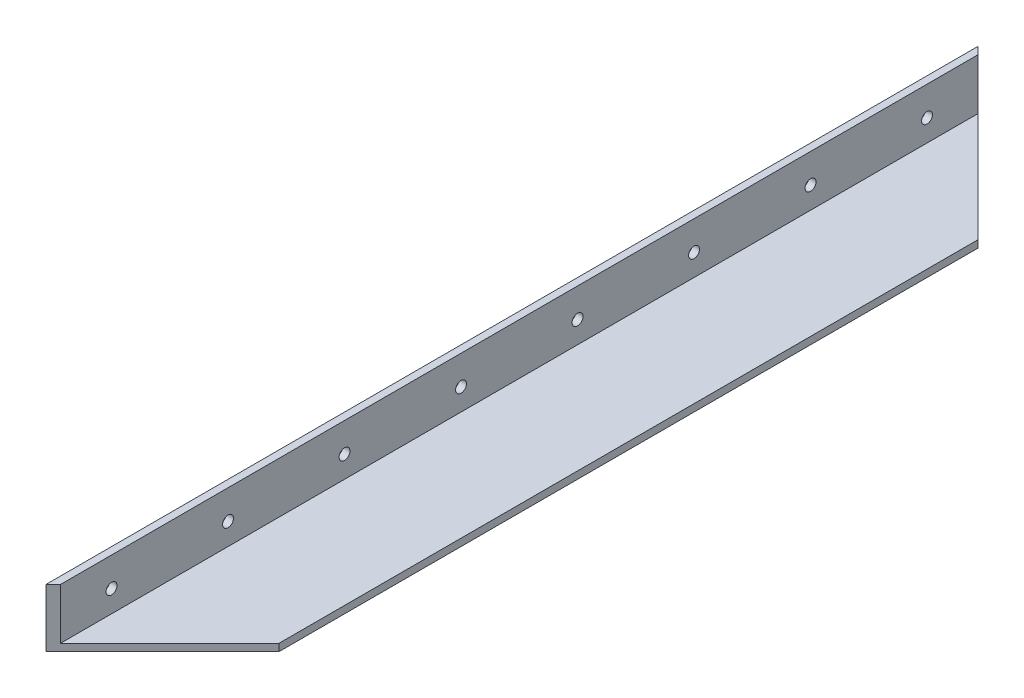
ISO-10303-21;
HEADER;
FILE_DESCRIPTION(('STEP AP214'),'2;1');
FILE_NAME('part.step','',(''),(''),'','','');
FILE_SCHEMA(('AUTOMOTIVE_DESIGN { 1 0 10303 214 1 1 1 1 }'));
ENDSEC;
DATA;
#1=APPLICATION_CONTEXT('core data for automotive mechanical design processes');
#2=APPLICATION_PROTOCOL_DEFINITION('international standard','automotive_design',2000,#1);
#3=PRODUCT_CONTEXT('',#1,'mechanical');
#4=PRODUCT('Part','Part','',(#3));
#5=PRODUCT_RELATED_PRODUCT_CATEGORY('part','',(#4));
#6=PRODUCT_DEFINITION_FORMATION('','',#4);
#7=PRODUCT_DEFINITION_CONTEXT('part definition',#1,'design');
#8=PRODUCT_DEFINITION('design','',#6,#7);
#9=PRODUCT_DEFINITION_SHAPE('','',#8);
#10=(LENGTH_UNIT() NAMED_UNIT(*) SI_UNIT(.MILLI.,.METRE.));
#11=(NAMED_UNIT(*) PLANE_ANGLE_UNIT() SI_UNIT($,.RADIAN.));
#12=(NAMED_UNIT(*) SI_UNIT($,.STERADIAN.) SOLID_ANGLE_UNIT());
#13=UNCERTAINTY_MEASURE_WITH_UNIT(LENGTH_MEASURE(1.E-05),#10,'distance_accuracy_value','');
#14=(GEOMETRIC_REPRESENTATION_CONTEXT(3) GLOBAL_UNCERTAINTY_ASSIGNED_CONTEXT((#13)) GLOBAL_UNIT_ASSIGNED_CONTEXT((#10,
#11,#12)) REPRESENTATION_CONTEXT('',''));
#15=CARTESIAN_POINT('',(0.,0.,0.));
#16=DIRECTION('',(0.,0.,1.));
#17=DIRECTION('',(1.,0.,0.));
#18=AXIS2_PLACEMENT_3D('',#15,#16,#17);
#19=CARTESIAN_POINT('',(3.175,0.,406.4));
#20=DIRECTION('',(1.,0.,0.));
#21=DIRECTION('',(0.,1.,0.));
#22=AXIS2_PLACEMENT_3D('',#19,#20,#21);
#23=PLANE('',#22);
#24=CARTESIAN_POINT('',(3.175,12.7,381.));
#25=DIRECTION('',(1.,0.,0.));
#26=DIRECTION('',(0.,1.,0.));
#27=AXIS2_PLACEMENT_3D('',#24,#25,#26);
#28=CIRCLE('',#27,2.38125000000001);
#29=CARTESIAN_POINT('',(3.175,15.08125,381.));
#30=VERTEX_POINT('',#29);
#31=EDGE_CURVE('E123',#30,#30,#28,.T.);
#32=ORIENTED_EDGE('',*,*,#31,.F.);
#33=EDGE_LOOP('',(#32));
#34=FACE_BOUND('',#33,.T.);
#35=CARTESIAN_POINT('',(3.175,12.7,330.2));
#36=DIRECTION('',(1.,0.,0.));
#37=DIRECTION('',(0.,1.,0.));
#38=AXIS2_PLACEMENT_3D('',#35,#36,#37);
#39=CIRCLE('',#38,2.38125000000001);
#40=CARTESIAN_POINT('',(3.175,15.08125,330.2));
#41=VERTEX_POINT('',#40);
#42=EDGE_CURVE('E262',#41,#41,#39,.T.);
#43=ORIENTED_EDGE('',*,*,#42,.F.);
#44=EDGE_LOOP('',(#43));
#45=FACE_BOUND('',#44,.T.);
#46=CARTESIAN_POINT('',(3.175,12.7,279.4));
#47=DIRECTION('',(1.,0.,0.));
#48=DIRECTION('',(0.,1.,0.));
#49=AXIS2_PLACEMENT_3D('',#46,#47,#48);
#50=CIRCLE('',#49,2.38125000000001);
#51=CARTESIAN_POINT('',(3.175,15.08125,279.4));
#52=VERTEX_POINT('',#51);
#53=EDGE_CURVE('E260',#52,#52,#50,.T.);
#54=ORIENTED_EDGE('',*,*,#53,.F.);
#55=EDGE_LOOP('',(#54));
#56=FACE_BOUND('',#55,.T.);
#57=CARTESIAN_POINT('',(3.175,12.7,228.6));
#58=DIRECTION('',(1.,0.,0.));
#59=DIRECTION('',(0.,1.,0.));
#60=AXIS2_PLACEMENT_3D('',#57,#58,#59);
#61=CIRCLE('',#60,2.38125000000001);
#62=CARTESIAN_POINT('',(3.175,15.08125,228.6));
#63=VERTEX_POINT('',#62);
#64=EDGE_CURVE('E257',#63,#63,#61,.T.);
#65=ORIENTED_EDGE('',*,*,#64,.F.);
#66=EDGE_LOOP('',(#65));
#67=FACE_BOUND('',#66,.T.);
#68=CARTESIAN_POINT('',(3.175,12.7,177.8));
#69=DIRECTION('',(1.,0.,0.));
#70=DIRECTION('',(0.,1.,0.));
#71=AXIS2_PLACEMENT_3D('',#68,#69,#70);
#72=CIRCLE('',#71,2.38125000000006);
#73=CARTESIAN_POINT('',(3.175,15.0812500000001,177.8));
#74=VERTEX_POINT('',#73);
#75=EDGE_CURVE('E254',#74,#74,#72,.T.);
#76=ORIENTED_EDGE('',*,*,#75,.F.);
#77=EDGE_LOOP('',(#76));
#78=FACE_BOUND('',#77,.T.);
#79=CARTESIAN_POINT('',(3.175,12.7,127.));
#80=DIRECTION('',(1.,0.,0.));
#81=DIRECTION('',(0.,1.,0.));
#82=AXIS2_PLACEMENT_3D('',#79,#80,#81);
#83=CIRCLE('',#82,2.38125000000001);
#84=CARTESIAN_POINT('',(3.175,15.08125,127.));
#85=VERTEX_POINT('',#84);
#86=EDGE_CURVE('E251',#85,#85,#83,.T.);
#87=ORIENTED_EDGE('',*,*,#86,.F.);
#88=EDGE_LOOP('',(#87));
#89=FACE_BOUND('',#88,.T.);
#90=CARTESIAN_POINT('',(3.175,12.7,76.2000000000002));
#91=DIRECTION('',(1.,0.,0.));
#92=DIRECTION('',(0.,1.,0.));
#93=AXIS2_PLACEMENT_3D('',#90,#91,#92);
#94=CIRCLE('',#93,2.38125000000001);
#95=CARTESIAN_POINT('',(3.175,15.08125,76.2000000000002));
#96=VERTEX_POINT('',#95);
#97=EDGE_CURVE('E226',#96,#96,#94,.T.);
#98=ORIENTED_EDGE('',*,*,#97,.F.);
#99=EDGE_LOOP('',(#98));
#100=FACE_BOUND('',#99,.T.);
#101=CARTESIAN_POINT('',(3.175,12.7,25.4000000000001));
#102=DIRECTION('',(1.,0.,0.));
#103=DIRECTION('',(0.,1.,0.));
#104=AXIS2_PLACEMENT_3D('',#101,#102,#103);
#105=CIRCLE('',#104,2.38125000000001);
#106=CARTESIAN_POINT('',(3.175,15.08125,25.4000000000001));
#107=VERTEX_POINT('',#106);
#108=EDGE_CURVE('E222',#107,#107,#105,.T.);
#109=ORIENTED_EDGE('',*,*,#108,.F.);
#110=EDGE_LOOP('',(#109));
#111=FACE_BOUND('',#110,.T.);
#112=DIRECTION('',(0.,0.,-1.));
#113=VECTOR('',#112,1.);
#114=CARTESIAN_POINT('',(3.175,3.175,406.4));
#115=LINE('',#114,#113);
#116=CARTESIAN_POINT('',(3.175,3.175,403.225));
#117=VERTEX_POINT('',#116);
#118=CARTESIAN_POINT('',(3.175,3.175,3.17500000000009));
#119=VERTEX_POINT('',#118);
#120=EDGE_CURVE('E118',#117,#119,#115,.T.);
#121=ORIENTED_EDGE('',*,*,#120,.T.);
#122=DIRECTION('',(0.,-1.,0.));
#123=VECTOR('',#122,1.);
#124=CARTESIAN_POINT('',(3.175,0.,3.17500000000009));
#125=LINE('',#124,#123);
#126=CARTESIAN_POINT('',(3.175,25.4,3.17500000000009));
#127=VERTEX_POINT('',#126);
#128=EDGE_CURVE('E57',#119,#127,#125,.F.);
#129=ORIENTED_EDGE('',*,*,#128,.T.);
#130=DIRECTION('',(0.,0.,-1.));
#131=VECTOR('',#130,1.);
#132=CARTESIAN_POINT('',(3.175,25.4,406.4));
#133=LINE('',#132,#131);
#134=CARTESIAN_POINT('',(3.175,25.4,403.225));
#135=VERTEX_POINT('',#134);
#136=EDGE_CURVE('E105',#135,#127,#133,.T.);
#137=ORIENTED_EDGE('',*,*,#136,.F.);
#138=DIRECTION('',(0.,-1.,0.));
#139=VECTOR('',#138,1.);
#140=CARTESIAN_POINT('',(3.175,0.,403.225));
#141=LINE('',#140,#139);
#142=EDGE_CURVE('E103',#135,#117,#141,.T.);
#143=ORIENTED_EDGE('',*,*,#142,.T.);
#144=EDGE_LOOP('',(#121,#129,#137,#143));
#145=FACE_BOUND('',#144,.T.);
#146=ADVANCED_FACE('F41',(#34,#45,#56,#67,#78,#89,#100,#111,#145),#23,.T.);
#147=CARTESIAN_POINT('',(0.,25.4,406.4));
#148=DIRECTION('',(0.,1.,0.));
#149=DIRECTION('',(-1.,0.,0.));
#150=AXIS2_PLACEMENT_3D('',#147,#148,#149);
#151=PLANE('',#150);
#152=ORIENTED_EDGE('',*,*,#136,.T.);
#153=DIRECTION('',(0.707106781186549,0.,0.707106781186546));
#154=VECTOR('',#153,1.);
#155=CARTESIAN_POINT('',(203.2,25.4,203.199999999999));
#156=LINE('',#155,#154);
#157=CARTESIAN_POINT('',(0.,25.4,0.));
#158=VERTEX_POINT('',#157);
#159=EDGE_CURVE('E50',#127,#158,#156,.F.);
#160=ORIENTED_EDGE('',*,*,#159,.T.);
#161=DIRECTION('',(0.,0.,-1.));
#162=VECTOR('',#161,1.);
#163=CARTESIAN_POINT('',(0.,25.4,406.4));
#164=LINE('',#163,#162);
#165=CARTESIAN_POINT('',(0.,25.4,406.4));
#166=VERTEX_POINT('',#165);
#167=EDGE_CURVE('E108',#166,#158,#164,.T.);
#168=ORIENTED_EDGE('',*,*,#167,.F.);
#169=DIRECTION('',(0.707106781186546,0.,-0.707106781186549));
#170=VECTOR('',#169,1.);
#171=CARTESIAN_POINT('',(0.,25.4,406.4));
#172=LINE('',#171,#170);
#173=EDGE_CURVE('E96',#166,#135,#172,.T.);
#174=ORIENTED_EDGE('',*,*,#173,.T.);
#175=EDGE_LOOP('',(#152,#160,#168,#174));
#176=FACE_BOUND('',#175,.T.);
#177=ADVANCED_FACE('F109',(#176),#151,.T.);
#178=CARTESIAN_POINT('',(0.,0.,406.4));
#179=DIRECTION('',(-1.,0.,0.));
#180=DIRECTION('',(0.,0.,1.));
#181=AXIS2_PLACEMENT_3D('',#178,#179,#180);
#182=PLANE('',#181);
#183=CARTESIAN_POINT('',(0.,12.7,381.));
#184=DIRECTION('',(-1.,0.,0.));
#185=DIRECTION('',(0.,0.,1.));
#186=AXIS2_PLACEMENT_3D('',#183,#184,#185);
#187=CIRCLE('',#186,2.38125000000001);
#188=CARTESIAN_POINT('',(0.,12.7,383.38125));
#189=VERTEX_POINT('',#188);
#190=EDGE_CURVE('E221',#189,#189,#187,.T.);
#191=ORIENTED_EDGE('',*,*,#190,.F.);
#192=EDGE_LOOP('',(#191));
#193=FACE_BOUND('',#192,.T.);
#194=CARTESIAN_POINT('',(0.,12.7,330.2));
#195=DIRECTION('',(-1.,0.,0.));
#196=DIRECTION('',(0.,0.,1.));
#197=AXIS2_PLACEMENT_3D('',#194,#195,#196);
#198=CIRCLE('',#197,2.38125000000001);
#199=CARTESIAN_POINT('',(0.,12.7,332.58125));
#200=VERTEX_POINT('',#199);
#201=EDGE_CURVE('E223',#200,#200,#198,.T.);
#202=ORIENTED_EDGE('',*,*,#201,.F.);
#203=EDGE_LOOP('',(#202));
#204=FACE_BOUND('',#203,.T.);
#205=CARTESIAN_POINT('',(0.,12.7,279.4));
#206=DIRECTION('',(-1.,0.,0.));
#207=DIRECTION('',(0.,0.,1.));
#208=AXIS2_PLACEMENT_3D('',#205,#206,#207);
#209=CIRCLE('',#208,2.38125000000001);
#210=CARTESIAN_POINT('',(0.,12.7,281.78125));
#211=VERTEX_POINT('',#210);
#212=EDGE_CURVE('E229',#211,#211,#209,.T.);
#213=ORIENTED_EDGE('',*,*,#212,.F.);
#214=EDGE_LOOP('',(#213));
#215=FACE_BOUND('',#214,.T.);
#216=CARTESIAN_POINT('',(0.,12.7,228.6));
#217=DIRECTION('',(-1.,0.,0.));
#218=DIRECTION('',(0.,0.,1.));
#219=AXIS2_PLACEMENT_3D('',#216,#217,#218);
#220=CIRCLE('',#219,2.38125000000001);
#221=CARTESIAN_POINT('',(0.,12.7,230.98125));
#222=VERTEX_POINT('',#221);
#223=EDGE_CURVE('E234',#222,#222,#220,.T.);
#224=ORIENTED_EDGE('',*,*,#223,.F.);
#225=EDGE_LOOP('',(#224));
#226=FACE_BOUND('',#225,.T.);
#227=CARTESIAN_POINT('',(0.,12.7,177.8));
#228=DIRECTION('',(-1.,0.,0.));
#229=DIRECTION('',(0.,0.,1.));
#230=AXIS2_PLACEMENT_3D('',#227,#228,#229);
#231=CIRCLE('',#230,2.38125000000006);
#232=CARTESIAN_POINT('',(0.,12.7,180.18125));
#233=VERTEX_POINT('',#232);
#234=EDGE_CURVE('E237',#233,#233,#231,.T.);
#235=ORIENTED_EDGE('',*,*,#234,.F.);
#236=EDGE_LOOP('',(#235));
#237=FACE_BOUND('',#236,.T.);
#238=CARTESIAN_POINT('',(0.,12.7,127.));
#239=DIRECTION('',(-1.,0.,0.));
#240=DIRECTION('',(0.,0.,1.));
#241=AXIS2_PLACEMENT_3D('',#238,#239,#240);
#242=CIRCLE('',#241,2.38125000000001);
#243=CARTESIAN_POINT('',(0.,12.7,129.38125));
#244=VERTEX_POINT('',#243);
#245=EDGE_CURVE('E240',#244,#244,#242,.T.);
#246=ORIENTED_EDGE('',*,*,#245,.F.);
#247=EDGE_LOOP('',(#246));
#248=FACE_BOUND('',#247,.T.);
#249=CARTESIAN_POINT('',(0.,12.7,76.2000000000002));
#250=DIRECTION('',(-1.,0.,0.));
#251=DIRECTION('',(0.,0.,1.));
#252=AXIS2_PLACEMENT_3D('',#249,#250,#251);
#253=CIRCLE('',#252,2.38125000000001);
#254=CARTESIAN_POINT('',(0.,12.7,78.5812500000002));
#255=VERTEX_POINT('',#254);
#256=EDGE_CURVE('E243',#255,#255,#253,.T.);
#257=ORIENTED_EDGE('',*,*,#256,.F.);
#258=EDGE_LOOP('',(#257));
#259=FACE_BOUND('',#258,.T.);
#260=CARTESIAN_POINT('',(0.,12.7,25.4000000000001));
#261=DIRECTION('',(-1.,0.,0.));
#262=DIRECTION('',(0.,0.,1.));
#263=AXIS2_PLACEMENT_3D('',#260,#261,#262);
#264=CIRCLE('',#263,2.38125000000001);
#265=CARTESIAN_POINT('',(0.,12.7,27.7812500000001));
#266=VERTEX_POINT('',#265);
#267=EDGE_CURVE('E246',#266,#266,#264,.T.);
#268=ORIENTED_EDGE('',*,*,#267,.F.);
#269=EDGE_LOOP('',(#268));
#270=FACE_BOUND('',#269,.T.);
#271=DIRECTION('',(0.,1.,0.));
#272=VECTOR('',#271,1.);
#273=CARTESIAN_POINT('',(0.,0.,0.));
#274=LINE('',#273,#272);
#275=CARTESIAN_POINT('',(0.,0.,0.));
#276=VERTEX_POINT('',#275);
#277=EDGE_CURVE('E119',#276,#158,#274,.T.);
#278=ORIENTED_EDGE('',*,*,#277,.F.);
#279=DIRECTION('',(0.,0.,-1.));
#280=VECTOR('',#279,1.);
#281=CARTESIAN_POINT('',(0.,0.,406.4));
#282=LINE('',#281,#280);
#283=CARTESIAN_POINT('',(0.,0.,406.4));
#284=VERTEX_POINT('',#283);
#285=EDGE_CURVE('E114',#284,#276,#282,.T.);
#286=ORIENTED_EDGE('',*,*,#285,.F.);
#287=DIRECTION('',(0.,1.,0.));
#288=VECTOR('',#287,1.);
#289=CARTESIAN_POINT('',(0.,0.,406.4));
#290=LINE('',#289,#288);
#291=EDGE_CURVE('E101',#284,#166,#290,.T.);
#292=ORIENTED_EDGE('',*,*,#291,.T.);
#293=ORIENTED_EDGE('',*,*,#167,.T.);
#294=EDGE_LOOP('',(#278,#286,#292,#293));
#295=FACE_BOUND('',#294,.T.);
#296=ADVANCED_FACE('F117',(#193,#204,#215,#226,#237,#248,#259,#270,#295),#182,.T.);
#297=CARTESIAN_POINT('',(0.,0.,406.4));
#298=DIRECTION('',(0.,1.,0.));
#299=DIRECTION('',(0.,0.,1.));
#300=AXIS2_PLACEMENT_3D('',#297,#298,#299);
#301=PLANE('',#300);
#302=ORIENTED_EDGE('',*,*,#285,.T.);
#303=DIRECTION('',(-0.707106781186549,0.,-0.707106781186546));
#304=VECTOR('',#303,1.);
#305=CARTESIAN_POINT('',(50.8,0.,50.8));
#306=LINE('',#305,#304);
#307=CARTESIAN_POINT('',(50.8,0.,50.8));
#308=VERTEX_POINT('',#307);
#309=EDGE_CURVE('E11',#276,#308,#306,.F.);
#310=ORIENTED_EDGE('',*,*,#309,.T.);
#311=DIRECTION('',(0.,0.,-1.));
#312=VECTOR('',#311,1.);
#313=CARTESIAN_POINT('',(50.8,0.,406.4));
#314=LINE('',#313,#312);
#315=CARTESIAN_POINT('',(50.8,0.,355.6));
#316=VERTEX_POINT('',#315);
#317=EDGE_CURVE('E129',#316,#308,#314,.T.);
#318=ORIENTED_EDGE('',*,*,#317,.F.);
#319=DIRECTION('',(-0.707106781186546,0.,0.707106781186549));
#320=VECTOR('',#319,1.);
#321=CARTESIAN_POINT('',(0.,0.,406.4));
#322=LINE('',#321,#320);
#323=EDGE_CURVE('E139',#316,#284,#322,.T.);
#324=ORIENTED_EDGE('',*,*,#323,.T.);
#325=EDGE_LOOP('',(#302,#310,#318,#324));
#326=FACE_BOUND('',#325,.T.);
#327=ADVANCED_FACE('F155',(#326),#301,.F.);
#328=CARTESIAN_POINT('',(50.8,0.,406.4));
#329=DIRECTION('',(-1.,0.,0.));
#330=DIRECTION('',(0.,0.,1.));
#331=AXIS2_PLACEMENT_3D('',#328,#329,#330);
#332=PLANE('',#331);
#333=ORIENTED_EDGE('',*,*,#317,.T.);
#334=DIRECTION('',(0.,1.,0.));
#335=VECTOR('',#334,1.);
#336=CARTESIAN_POINT('',(50.8,0.,50.8));
#337=LINE('',#336,#335);
#338=CARTESIAN_POINT('',(50.8,3.175,50.8));
#339=VERTEX_POINT('',#338);
#340=EDGE_CURVE('E141',#308,#339,#337,.T.);
#341=ORIENTED_EDGE('',*,*,#340,.T.);
#342=DIRECTION('',(0.,0.,-1.));
#343=VECTOR('',#342,1.);
#344=CARTESIAN_POINT('',(50.8,3.175,406.4));
#345=LINE('',#344,#343);
#346=CARTESIAN_POINT('',(50.8,3.175,355.6));
#347=VERTEX_POINT('',#346);
#348=EDGE_CURVE('E121',#347,#339,#345,.T.);
#349=ORIENTED_EDGE('',*,*,#348,.F.);
#350=DIRECTION('',(0.,-1.,0.));
#351=VECTOR('',#350,1.);
#352=CARTESIAN_POINT('',(50.8,0.,355.6));
#353=LINE('',#352,#351);
#354=EDGE_CURVE('E137',#347,#316,#353,.T.);
#355=ORIENTED_EDGE('',*,*,#354,.T.);
#356=EDGE_LOOP('',(#333,#341,#349,#355));
#357=FACE_BOUND('',#356,.T.);
#358=ADVANCED_FACE('F148',(#357),#332,.F.);
#359=CARTESIAN_POINT('',(0.,3.175,406.4));
#360=DIRECTION('',(0.,-1.,0.));
#361=DIRECTION('',(1.,0.,0.));
#362=AXIS2_PLACEMENT_3D('',#359,#360,#361);
#363=PLANE('',#362);
#364=ORIENTED_EDGE('',*,*,#348,.T.);
#365=DIRECTION('',(0.707106781186549,0.,0.707106781186546));
#366=VECTOR('',#365,1.);
#367=CARTESIAN_POINT('',(50.8,3.175,50.8));
#368=LINE('',#367,#366);
#369=EDGE_CURVE('E65',#339,#119,#368,.F.);
#370=ORIENTED_EDGE('',*,*,#369,.T.);
#371=ORIENTED_EDGE('',*,*,#120,.F.);
#372=DIRECTION('',(0.707106781186546,0.,-0.707106781186549));
#373=VECTOR('',#372,1.);
#374=CARTESIAN_POINT('',(0.,3.175,406.4));
#375=LINE('',#374,#373);
#376=EDGE_CURVE('E135',#117,#347,#375,.T.);
#377=ORIENTED_EDGE('',*,*,#376,.T.);
#378=EDGE_LOOP('',(#364,#370,#371,#377));
#379=FACE_BOUND('',#378,.T.);
#380=ADVANCED_FACE('F153',(#379),#363,.F.);
#381=CARTESIAN_POINT('',(50.8,12.7,25.4000000000001));
#382=DIRECTION('',(-1.,0.,0.));
#383=DIRECTION('',(0.,0.,1.));
#384=AXIS2_PLACEMENT_3D('',#381,#382,#383);
#385=CYLINDRICAL_SURFACE('',#384,2.38125000000001);
#386=ORIENTED_EDGE('',*,*,#108,.T.);
#387=EDGE_LOOP('',(#386));
#388=FACE_BOUND('',#387,.T.);
#389=ORIENTED_EDGE('',*,*,#267,.T.);
#390=EDGE_LOOP('',(#389));
#391=FACE_BOUND('',#390,.T.);
#392=ADVANCED_FACE('F185',(#388,#391),#385,.F.);
#393=CARTESIAN_POINT('',(50.8,12.7,76.2000000000002));
#394=DIRECTION('',(-1.,0.,0.));
#395=DIRECTION('',(0.,0.,1.));
#396=AXIS2_PLACEMENT_3D('',#393,#394,#395);
#397=CYLINDRICAL_SURFACE('',#396,2.38125000000001);
#398=ORIENTED_EDGE('',*,*,#97,.T.);
#399=EDGE_LOOP('',(#398));
#400=FACE_BOUND('',#399,.T.);
#401=ORIENTED_EDGE('',*,*,#256,.T.);
#402=EDGE_LOOP('',(#401));
#403=FACE_BOUND('',#402,.T.);
#404=ADVANCED_FACE('F188',(#400,#403),#397,.F.);
#405=CARTESIAN_POINT('',(50.8,12.7,127.));
#406=DIRECTION('',(-1.,0.,0.));
#407=DIRECTION('',(0.,0.,1.));
#408=AXIS2_PLACEMENT_3D('',#405,#406,#407);
#409=CYLINDRICAL_SURFACE('',#408,2.38125000000001);
#410=ORIENTED_EDGE('',*,*,#86,.T.);
#411=EDGE_LOOP('',(#410));
#412=FACE_BOUND('',#411,.T.);
#413=ORIENTED_EDGE('',*,*,#245,.T.);
#414=EDGE_LOOP('',(#413));
#415=FACE_BOUND('',#414,.T.);
#416=ADVANCED_FACE('F192',(#412,#415),#409,.F.);
#417=CARTESIAN_POINT('',(50.8,12.7,177.8));
#418=DIRECTION('',(-1.,0.,0.));
#419=DIRECTION('',(0.,0.,1.));
#420=AXIS2_PLACEMENT_3D('',#417,#418,#419);
#421=CYLINDRICAL_SURFACE('',#420,2.38125000000006);
#422=ORIENTED_EDGE('',*,*,#75,.T.);
#423=EDGE_LOOP('',(#422));
#424=FACE_BOUND('',#423,.T.);
#425=ORIENTED_EDGE('',*,*,#234,.T.);
#426=EDGE_LOOP('',(#425));
#427=FACE_BOUND('',#426,.T.);
#428=ADVANCED_FACE('F196',(#424,#427),#421,.F.);
#429=CARTESIAN_POINT('',(50.8,12.7,228.6));
#430=DIRECTION('',(-1.,0.,0.));
#431=DIRECTION('',(0.,0.,1.));
#432=AXIS2_PLACEMENT_3D('',#429,#430,#431);
#433=CYLINDRICAL_SURFACE('',#432,2.38125000000001);
#434=ORIENTED_EDGE('',*,*,#64,.T.);
#435=EDGE_LOOP('',(#434));
#436=FACE_BOUND('',#435,.T.);
#437=ORIENTED_EDGE('',*,*,#223,.T.);
#438=EDGE_LOOP('',(#437));
#439=FACE_BOUND('',#438,.T.);
#440=ADVANCED_FACE('F200',(#436,#439),#433,.F.);
#441=CARTESIAN_POINT('',(50.8,12.7,279.4));
#442=DIRECTION('',(-1.,0.,0.));
#443=DIRECTION('',(0.,0.,1.));
#444=AXIS2_PLACEMENT_3D('',#441,#442,#443);
#445=CYLINDRICAL_SURFACE('',#444,2.38125000000001);
#446=ORIENTED_EDGE('',*,*,#53,.T.);
#447=EDGE_LOOP('',(#446));
#448=FACE_BOUND('',#447,.T.);
#449=ORIENTED_EDGE('',*,*,#212,.T.);
#450=EDGE_LOOP('',(#449));
#451=FACE_BOUND('',#450,.T.);
#452=ADVANCED_FACE('F204',(#448,#451),#445,.F.);
#453=CARTESIAN_POINT('',(50.8,12.7,330.2));
#454=DIRECTION('',(-1.,0.,0.));
#455=DIRECTION('',(0.,0.,1.));
#456=AXIS2_PLACEMENT_3D('',#453,#454,#455);
#457=CYLINDRICAL_SURFACE('',#456,2.38125000000001);
#458=ORIENTED_EDGE('',*,*,#42,.T.);
#459=EDGE_LOOP('',(#458));
#460=FACE_BOUND('',#459,.T.);
#461=ORIENTED_EDGE('',*,*,#201,.T.);
#462=EDGE_LOOP('',(#461));
#463=FACE_BOUND('',#462,.T.);
#464=ADVANCED_FACE('F208',(#460,#463),#457,.F.);
#465=CARTESIAN_POINT('',(50.8,12.7,381.));
#466=DIRECTION('',(-1.,0.,0.));
#467=DIRECTION('',(0.,0.,1.));
#468=AXIS2_PLACEMENT_3D('',#465,#466,#467);
#469=CYLINDRICAL_SURFACE('',#468,2.38125000000001);
#470=ORIENTED_EDGE('',*,*,#31,.T.);
#471=EDGE_LOOP('',(#470));
#472=FACE_BOUND('',#471,.T.);
#473=ORIENTED_EDGE('',*,*,#190,.T.);
#474=EDGE_LOOP('',(#473));
#475=FACE_BOUND('',#474,.T.);
#476=ADVANCED_FACE('F160',(#472,#475),#469,.F.);
#477=CARTESIAN_POINT('',(0.,0.,406.4));
#478=DIRECTION('',(0.707106781186549,0.,0.707106781186546));
#479=DIRECTION('',(0.,-1.,0.));
#480=AXIS2_PLACEMENT_3D('',#477,#478,#479);
#481=PLANE('',#480);
#482=ORIENTED_EDGE('',*,*,#323,.F.);
#483=ORIENTED_EDGE('',*,*,#354,.F.);
#484=ORIENTED_EDGE('',*,*,#376,.F.);
#485=ORIENTED_EDGE('',*,*,#142,.F.);
#486=ORIENTED_EDGE('',*,*,#173,.F.);
#487=ORIENTED_EDGE('',*,*,#291,.F.);
#488=EDGE_LOOP('',(#482,#483,#484,#485,#486,#487));
#489=FACE_BOUND('',#488,.T.);
#490=ADVANCED_FACE('F99',(#489),#481,.T.);
#491=CARTESIAN_POINT('',(50.8,0.,50.8));
#492=DIRECTION('',(-0.707106781186546,0.,0.707106781186549));
#493=DIRECTION('',(0.,1.,0.));
#494=AXIS2_PLACEMENT_3D('',#491,#492,#493);
#495=PLANE('',#494);
#496=ORIENTED_EDGE('',*,*,#309,.F.);
#497=ORIENTED_EDGE('',*,*,#277,.T.);
#498=ORIENTED_EDGE('',*,*,#159,.F.);
#499=ORIENTED_EDGE('',*,*,#128,.F.);
#500=ORIENTED_EDGE('',*,*,#369,.F.);
#501=ORIENTED_EDGE('',*,*,#340,.F.);
#502=EDGE_LOOP('',(#496,#497,#498,#499,#500,#501));
#503=FACE_BOUND('',#502,.T.);
#504=ADVANCED_FACE('F44',(#503),#495,.F.);
#505=CLOSED_SHELL('',(#146,#177,#296,#327,#358,#380,#392,#404,#416,#428,#440,#452,#464,#476,
#490,#504));
#506=MANIFOLD_SOLID_BREP('B2',#505);
#507=ADVANCED_BREP_SHAPE_REPRESENTATION('',(#18,#506),#14);
#508=SHAPE_DEFINITION_REPRESENTATION(#9,#507);
ENDSEC;
END-ISO-10303-21;
